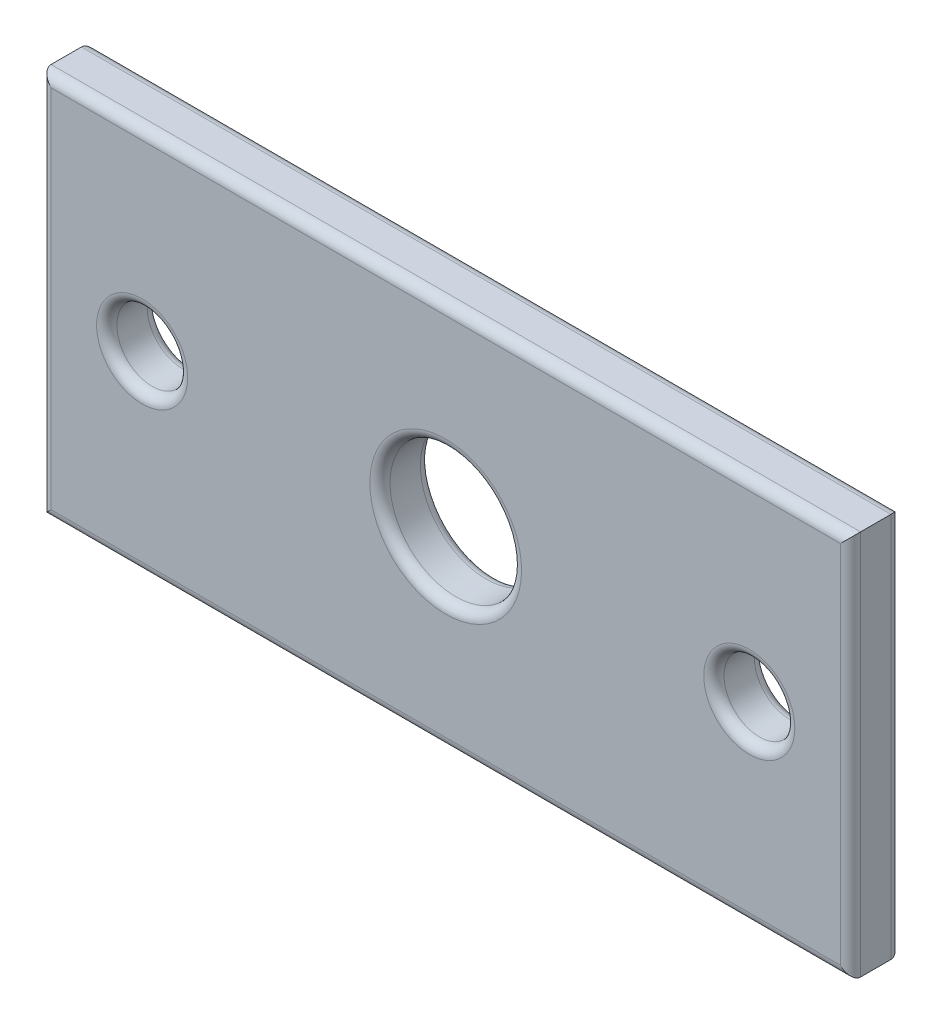
ISO-10303-21;
HEADER;
FILE_DESCRIPTION(('STEP AP214'),'2;1');
FILE_NAME('part.step','',(''),(''),'','','');
FILE_SCHEMA(('AUTOMOTIVE_DESIGN { 1 0 10303 214 1 1 1 1 }'));
ENDSEC;
DATA;
#1=APPLICATION_CONTEXT('core data for automotive mechanical design processes');
#2=APPLICATION_PROTOCOL_DEFINITION('international standard','automotive_design',2000,#1);
#3=PRODUCT_CONTEXT('',#1,'mechanical');
#4=PRODUCT('Part','Part','',(#3));
#5=PRODUCT_RELATED_PRODUCT_CATEGORY('part','',(#4));
#6=PRODUCT_DEFINITION_FORMATION('','',#4);
#7=PRODUCT_DEFINITION_CONTEXT('part definition',#1,'design');
#8=PRODUCT_DEFINITION('design','',#6,#7);
#9=PRODUCT_DEFINITION_SHAPE('','',#8);
#10=(LENGTH_UNIT() NAMED_UNIT(*) SI_UNIT(.MILLI.,.METRE.));
#11=(NAMED_UNIT(*) PLANE_ANGLE_UNIT() SI_UNIT($,.RADIAN.));
#12=(NAMED_UNIT(*) SI_UNIT($,.STERADIAN.) SOLID_ANGLE_UNIT());
#13=UNCERTAINTY_MEASURE_WITH_UNIT(LENGTH_MEASURE(1.E-05),#10,'distance_accuracy_value','');
#14=(GEOMETRIC_REPRESENTATION_CONTEXT(3) GLOBAL_UNCERTAINTY_ASSIGNED_CONTEXT((#13)) GLOBAL_UNIT_ASSIGNED_CONTEXT((#10,
#11,#12)) REPRESENTATION_CONTEXT('',''));
#15=CARTESIAN_POINT('',(0.,0.,0.));
#16=DIRECTION('',(0.,0.,1.));
#17=DIRECTION('',(1.,0.,0.));
#18=AXIS2_PLACEMENT_3D('',#15,#16,#17);
#19=CARTESIAN_POINT('',(80.,0.,5.));
#20=DIRECTION('',(1.,0.,0.));
#21=DIRECTION('',(0.,1.,0.));
#22=AXIS2_PLACEMENT_3D('',#19,#20,#21);
#23=PLANE('',#22);
#24=DIRECTION('',(0.,0.,-1.));
#25=VECTOR('',#24,1.);
#26=CARTESIAN_POINT('',(80.,-38.1,5.));
#27=LINE('',#26,#25);
#28=CARTESIAN_POINT('',(80.,-38.1,4.));
#29=VERTEX_POINT('',#28);
#30=CARTESIAN_POINT('',(80.,-38.1,1.));
#31=VERTEX_POINT('',#30);
#32=EDGE_CURVE('E191',#29,#31,#27,.T.);
#33=ORIENTED_EDGE('',*,*,#32,.T.);
#34=DIRECTION('',(0.,-1.,0.));
#35=VECTOR('',#34,1.);
#36=CARTESIAN_POINT('',(80.,0.,1.));
#37=LINE('',#36,#35);
#38=CARTESIAN_POINT('',(80.,0.,1.));
#39=VERTEX_POINT('',#38);
#40=EDGE_CURVE('E173',#31,#39,#37,.F.);
#41=ORIENTED_EDGE('',*,*,#40,.T.);
#42=DIRECTION('',(0.,0.,-1.));
#43=VECTOR('',#42,1.);
#44=CARTESIAN_POINT('',(80.,0.,5.));
#45=LINE('',#44,#43);
#46=CARTESIAN_POINT('',(80.,0.,4.));
#47=VERTEX_POINT('',#46);
#48=EDGE_CURVE('E122',#47,#39,#45,.T.);
#49=ORIENTED_EDGE('',*,*,#48,.F.);
#50=DIRECTION('',(0.,-1.,0.));
#51=VECTOR('',#50,1.);
#52=CARTESIAN_POINT('',(80.,0.,4.));
#53=LINE('',#52,#51);
#54=EDGE_CURVE('E171',#47,#29,#53,.T.);
#55=ORIENTED_EDGE('',*,*,#54,.T.);
#56=EDGE_LOOP('',(#33,#41,#49,#55));
#57=FACE_BOUND('',#56,.T.);
#58=ADVANCED_FACE('F35',(#57),#23,.T.);
#59=CARTESIAN_POINT('',(0.,0.,5.));
#60=DIRECTION('',(0.,1.,0.));
#61=DIRECTION('',(0.,0.,1.));
#62=AXIS2_PLACEMENT_3D('',#59,#60,#61);
#63=PLANE('',#62);
#64=ORIENTED_EDGE('',*,*,#48,.T.);
#65=DIRECTION('',(1.,0.,0.));
#66=VECTOR('',#65,1.);
#67=CARTESIAN_POINT('',(0.,0.,1.));
#68=LINE('',#67,#66);
#69=CARTESIAN_POINT('',(0.,0.,1.));
#70=VERTEX_POINT('',#69);
#71=EDGE_CURVE('E109',#39,#70,#68,.F.);
#72=ORIENTED_EDGE('',*,*,#71,.T.);
#73=DIRECTION('',(0.,0.,-1.));
#74=VECTOR('',#73,1.);
#75=CARTESIAN_POINT('',(0.,0.,5.));
#76=LINE('',#75,#74);
#77=CARTESIAN_POINT('',(0.,0.,4.));
#78=VERTEX_POINT('',#77);
#79=EDGE_CURVE('E213',#78,#70,#76,.T.);
#80=ORIENTED_EDGE('',*,*,#79,.F.);
#81=DIRECTION('',(1.,0.,0.));
#82=VECTOR('',#81,1.);
#83=CARTESIAN_POINT('',(0.,0.,4.));
#84=LINE('',#83,#82);
#85=EDGE_CURVE('E159',#78,#47,#84,.T.);
#86=ORIENTED_EDGE('',*,*,#85,.T.);
#87=EDGE_LOOP('',(#64,#72,#80,#86));
#88=FACE_BOUND('',#87,.T.);
#89=ADVANCED_FACE('F211',(#88),#63,.T.);
#90=CARTESIAN_POINT('',(0.,0.,5.));
#91=DIRECTION('',(1.,0.,0.));
#92=DIRECTION('',(0.,1.,0.));
#93=AXIS2_PLACEMENT_3D('',#90,#91,#92);
#94=PLANE('',#93);
#95=ORIENTED_EDGE('',*,*,#79,.T.);
#96=DIRECTION('',(0.,-1.,0.));
#97=VECTOR('',#96,1.);
#98=CARTESIAN_POINT('',(0.,0.,1.));
#99=LINE('',#98,#97);
#100=CARTESIAN_POINT('',(0.,-38.1,1.));
#101=VERTEX_POINT('',#100);
#102=EDGE_CURVE('E164',#70,#101,#99,.T.);
#103=ORIENTED_EDGE('',*,*,#102,.T.);
#104=DIRECTION('',(0.,0.,-1.));
#105=VECTOR('',#104,1.);
#106=CARTESIAN_POINT('',(0.,-38.1,5.));
#107=LINE('',#106,#105);
#108=CARTESIAN_POINT('',(0.,-38.1,4.));
#109=VERTEX_POINT('',#108);
#110=EDGE_CURVE('E218',#109,#101,#107,.T.);
#111=ORIENTED_EDGE('',*,*,#110,.F.);
#112=DIRECTION('',(0.,-1.,0.));
#113=VECTOR('',#112,1.);
#114=CARTESIAN_POINT('',(0.,0.,4.));
#115=LINE('',#114,#113);
#116=EDGE_CURVE('E162',#109,#78,#115,.F.);
#117=ORIENTED_EDGE('',*,*,#116,.T.);
#118=EDGE_LOOP('',(#95,#103,#111,#117));
#119=FACE_BOUND('',#118,.T.);
#120=ADVANCED_FACE('F231',(#119),#94,.F.);
#121=CARTESIAN_POINT('',(10.,-19.05,5.));
#122=DIRECTION('',(0.,0.,-1.));
#123=DIRECTION('',(-1.,0.,0.));
#124=AXIS2_PLACEMENT_3D('',#121,#122,#123);
#125=CYLINDRICAL_SURFACE('',#124,3.5);
#126=CARTESIAN_POINT('',(10.,-19.05,1.));
#127=DIRECTION('',(0.,0.,1.));
#128=DIRECTION('',(1.,0.,0.));
#129=AXIS2_PLACEMENT_3D('',#126,#127,#128);
#130=CIRCLE('',#129,3.5);
#131=CARTESIAN_POINT('',(13.5,-19.05,1.));
#132=VERTEX_POINT('',#131);
#133=EDGE_CURVE('E150',#132,#132,#130,.F.);
#134=ORIENTED_EDGE('',*,*,#133,.T.);
#135=EDGE_LOOP('',(#134));
#136=FACE_BOUND('',#135,.T.);
#137=CARTESIAN_POINT('',(10.,-19.05,4.));
#138=DIRECTION('',(0.,0.,1.));
#139=DIRECTION('',(1.,0.,0.));
#140=AXIS2_PLACEMENT_3D('',#137,#138,#139);
#141=CIRCLE('',#140,3.5);
#142=CARTESIAN_POINT('',(13.5,-19.05,4.));
#143=VERTEX_POINT('',#142);
#144=EDGE_CURVE('E147',#143,#143,#141,.T.);
#145=ORIENTED_EDGE('',*,*,#144,.T.);
#146=EDGE_LOOP('',(#145));
#147=FACE_BOUND('',#146,.T.);
#148=ADVANCED_FACE('F380',(#136,#147),#125,.F.);
#149=CARTESIAN_POINT('',(40.,-19.05,5.));
#150=DIRECTION('',(0.,0.,-1.));
#151=DIRECTION('',(-1.,0.,0.));
#152=AXIS2_PLACEMENT_3D('',#149,#150,#151);
#153=CYLINDRICAL_SURFACE('',#152,6.5);
#154=CARTESIAN_POINT('',(40.,-19.05,1.));
#155=DIRECTION('',(0.,0.,1.));
#156=DIRECTION('',(1.,0.,0.));
#157=AXIS2_PLACEMENT_3D('',#154,#155,#156);
#158=CIRCLE('',#157,6.5);
#159=CARTESIAN_POINT('',(46.5,-19.05,1.));
#160=VERTEX_POINT('',#159);
#161=EDGE_CURVE('E156',#160,#160,#158,.F.);
#162=ORIENTED_EDGE('',*,*,#161,.T.);
#163=EDGE_LOOP('',(#162));
#164=FACE_BOUND('',#163,.T.);
#165=CARTESIAN_POINT('',(40.,-19.05,4.));
#166=DIRECTION('',(0.,0.,1.));
#167=DIRECTION('',(1.,0.,0.));
#168=AXIS2_PLACEMENT_3D('',#165,#166,#167);
#169=CIRCLE('',#168,6.5);
#170=CARTESIAN_POINT('',(46.5,-19.05,4.));
#171=VERTEX_POINT('',#170);
#172=EDGE_CURVE('E153',#171,#171,#169,.T.);
#173=ORIENTED_EDGE('',*,*,#172,.T.);
#174=EDGE_LOOP('',(#173));
#175=FACE_BOUND('',#174,.T.);
#176=ADVANCED_FACE('F371',(#164,#175),#153,.F.);
#177=CARTESIAN_POINT('',(0.,-38.1,5.));
#178=DIRECTION('',(0.,1.,0.));
#179=DIRECTION('',(0.,0.,1.));
#180=AXIS2_PLACEMENT_3D('',#177,#178,#179);
#181=PLANE('',#180);
#182=ORIENTED_EDGE('',*,*,#110,.T.);
#183=DIRECTION('',(1.,0.,0.));
#184=VECTOR('',#183,1.);
#185=CARTESIAN_POINT('',(0.,-38.1,1.));
#186=LINE('',#185,#184);
#187=EDGE_CURVE('E169',#101,#31,#186,.T.);
#188=ORIENTED_EDGE('',*,*,#187,.T.);
#189=ORIENTED_EDGE('',*,*,#32,.F.);
#190=DIRECTION('',(1.,0.,0.));
#191=VECTOR('',#190,1.);
#192=CARTESIAN_POINT('',(0.,-38.1,4.));
#193=LINE('',#192,#191);
#194=EDGE_CURVE('E166',#29,#109,#193,.F.);
#195=ORIENTED_EDGE('',*,*,#194,.T.);
#196=EDGE_LOOP('',(#182,#188,#189,#195));
#197=FACE_BOUND('',#196,.T.);
#198=ADVANCED_FACE('F235',(#197),#181,.F.);
#199=CARTESIAN_POINT('',(70.,-19.05,5.));
#200=DIRECTION('',(0.,0.,-1.));
#201=DIRECTION('',(-1.,0.,0.));
#202=AXIS2_PLACEMENT_3D('',#199,#200,#201);
#203=CYLINDRICAL_SURFACE('',#202,3.50000000000001);
#204=CARTESIAN_POINT('',(70.,-19.05,1.));
#205=DIRECTION('',(0.,0.,1.));
#206=DIRECTION('',(1.,0.,0.));
#207=AXIS2_PLACEMENT_3D('',#204,#205,#206);
#208=CIRCLE('',#207,3.50000000000001);
#209=CARTESIAN_POINT('',(73.5,-19.05,1.));
#210=VERTEX_POINT('',#209);
#211=EDGE_CURVE('E144',#210,#210,#208,.F.);
#212=ORIENTED_EDGE('',*,*,#211,.T.);
#213=EDGE_LOOP('',(#212));
#214=FACE_BOUND('',#213,.T.);
#215=CARTESIAN_POINT('',(70.,-19.05,4.));
#216=DIRECTION('',(0.,0.,1.));
#217=DIRECTION('',(1.,0.,0.));
#218=AXIS2_PLACEMENT_3D('',#215,#216,#217);
#219=CIRCLE('',#218,3.50000000000001);
#220=CARTESIAN_POINT('',(73.5,-19.05,4.));
#221=VERTEX_POINT('',#220);
#222=EDGE_CURVE('E141',#221,#221,#219,.T.);
#223=ORIENTED_EDGE('',*,*,#222,.T.);
#224=EDGE_LOOP('',(#223));
#225=FACE_BOUND('',#224,.T.);
#226=ADVANCED_FACE('F243',(#214,#225),#203,.F.);
#227=CARTESIAN_POINT('',(0.,0.,5.));
#228=DIRECTION('',(0.,0.,1.));
#229=DIRECTION('',(1.,0.,0.));
#230=AXIS2_PLACEMENT_3D('',#227,#228,#229);
#231=PLANE('',#230);
#232=CARTESIAN_POINT('',(70.,-19.05,5.));
#233=DIRECTION('',(0.,0.,1.));
#234=DIRECTION('',(1.,0.,0.));
#235=AXIS2_PLACEMENT_3D('',#232,#233,#234);
#236=CIRCLE('',#235,4.50000000000001);
#237=CARTESIAN_POINT('',(74.5,-19.05,5.));
#238=VERTEX_POINT('',#237);
#239=EDGE_CURVE('E11',#238,#238,#236,.F.);
#240=ORIENTED_EDGE('',*,*,#239,.T.);
#241=EDGE_LOOP('',(#240));
#242=FACE_BOUND('',#241,.T.);
#243=CARTESIAN_POINT('',(10.,-19.05,5.));
#244=DIRECTION('',(0.,0.,1.));
#245=DIRECTION('',(1.,0.,0.));
#246=AXIS2_PLACEMENT_3D('',#243,#244,#245);
#247=CIRCLE('',#246,4.5);
#248=CARTESIAN_POINT('',(14.5,-19.05,5.));
#249=VERTEX_POINT('',#248);
#250=EDGE_CURVE('E44',#249,#249,#247,.F.);
#251=ORIENTED_EDGE('',*,*,#250,.T.);
#252=EDGE_LOOP('',(#251));
#253=FACE_BOUND('',#252,.T.);
#254=CARTESIAN_POINT('',(40.,-19.05,5.));
#255=DIRECTION('',(0.,0.,1.));
#256=DIRECTION('',(1.,0.,0.));
#257=AXIS2_PLACEMENT_3D('',#254,#255,#256);
#258=CIRCLE('',#257,7.5);
#259=CARTESIAN_POINT('',(47.5,-19.05,5.));
#260=VERTEX_POINT('',#259);
#261=EDGE_CURVE('E181',#260,#260,#258,.F.);
#262=ORIENTED_EDGE('',*,*,#261,.T.);
#263=EDGE_LOOP('',(#262));
#264=FACE_BOUND('',#263,.T.);
#265=DIRECTION('',(0.,-1.,0.));
#266=VECTOR('',#265,1.);
#267=CARTESIAN_POINT('',(1.,-38.1,5.));
#268=LINE('',#267,#266);
#269=CARTESIAN_POINT('',(1.,-1.,5.));
#270=VERTEX_POINT('',#269);
#271=CARTESIAN_POINT('',(1.,-37.1,5.));
#272=VERTEX_POINT('',#271);
#273=EDGE_CURVE('E52',#270,#272,#268,.T.);
#274=ORIENTED_EDGE('',*,*,#273,.T.);
#275=DIRECTION('',(1.,0.,0.));
#276=VECTOR('',#275,1.);
#277=CARTESIAN_POINT('',(80.,-37.1,5.));
#278=LINE('',#277,#276);
#279=CARTESIAN_POINT('',(79.,-37.1,5.));
#280=VERTEX_POINT('',#279);
#281=EDGE_CURVE('E179',#272,#280,#278,.T.);
#282=ORIENTED_EDGE('',*,*,#281,.T.);
#283=DIRECTION('',(0.,-1.,0.));
#284=VECTOR('',#283,1.);
#285=CARTESIAN_POINT('',(79.,0.,5.));
#286=LINE('',#285,#284);
#287=CARTESIAN_POINT('',(79.,-1.,5.));
#288=VERTEX_POINT('',#287);
#289=EDGE_CURVE('E175',#280,#288,#286,.F.);
#290=ORIENTED_EDGE('',*,*,#289,.T.);
#291=DIRECTION('',(1.,0.,0.));
#292=VECTOR('',#291,1.);
#293=CARTESIAN_POINT('',(0.,-1.,5.));
#294=LINE('',#293,#292);
#295=EDGE_CURVE('E57',#288,#270,#294,.F.);
#296=ORIENTED_EDGE('',*,*,#295,.T.);
#297=EDGE_LOOP('',(#274,#282,#290,#296));
#298=FACE_BOUND('',#297,.T.);
#299=ADVANCED_FACE('F241',(#242,#253,#264,#298),#231,.T.);
#300=CARTESIAN_POINT('',(0.,0.,0.));
#301=DIRECTION('',(0.,0.,1.));
#302=DIRECTION('',(1.,0.,0.));
#303=AXIS2_PLACEMENT_3D('',#300,#301,#302);
#304=PLANE('',#303);
#305=CARTESIAN_POINT('',(70.,-19.05,0.));
#306=DIRECTION('',(0.,0.,1.));
#307=DIRECTION('',(1.,0.,0.));
#308=AXIS2_PLACEMENT_3D('',#305,#306,#307);
#309=CIRCLE('',#308,4.50000000000001);
#310=CARTESIAN_POINT('',(74.5,-19.05,0.));
#311=VERTEX_POINT('',#310);
#312=EDGE_CURVE('E138',#311,#311,#309,.T.);
#313=ORIENTED_EDGE('',*,*,#312,.T.);
#314=EDGE_LOOP('',(#313));
#315=FACE_BOUND('',#314,.T.);
#316=CARTESIAN_POINT('',(10.,-19.05,0.));
#317=DIRECTION('',(0.,0.,1.));
#318=DIRECTION('',(1.,0.,0.));
#319=AXIS2_PLACEMENT_3D('',#316,#317,#318);
#320=CIRCLE('',#319,4.5);
#321=CARTESIAN_POINT('',(14.5,-19.05,0.));
#322=VERTEX_POINT('',#321);
#323=EDGE_CURVE('E131',#322,#322,#320,.T.);
#324=ORIENTED_EDGE('',*,*,#323,.T.);
#325=EDGE_LOOP('',(#324));
#326=FACE_BOUND('',#325,.T.);
#327=CARTESIAN_POINT('',(40.,-19.05,0.));
#328=DIRECTION('',(0.,0.,1.));
#329=DIRECTION('',(1.,0.,0.));
#330=AXIS2_PLACEMENT_3D('',#327,#328,#329);
#331=CIRCLE('',#330,7.5);
#332=CARTESIAN_POINT('',(47.5,-19.05,0.));
#333=VERTEX_POINT('',#332);
#334=EDGE_CURVE('E128',#333,#333,#331,.T.);
#335=ORIENTED_EDGE('',*,*,#334,.T.);
#336=EDGE_LOOP('',(#335));
#337=FACE_BOUND('',#336,.T.);
#338=DIRECTION('',(0.,-1.,0.));
#339=VECTOR('',#338,1.);
#340=CARTESIAN_POINT('',(1.,0.,0.));
#341=LINE('',#340,#339);
#342=CARTESIAN_POINT('',(1.,-37.1,0.));
#343=VERTEX_POINT('',#342);
#344=CARTESIAN_POINT('',(1.,-1.,0.));
#345=VERTEX_POINT('',#344);
#346=EDGE_CURVE('E126',#343,#345,#341,.F.);
#347=ORIENTED_EDGE('',*,*,#346,.T.);
#348=DIRECTION('',(1.,0.,0.));
#349=VECTOR('',#348,1.);
#350=CARTESIAN_POINT('',(80.,-1.,0.));
#351=LINE('',#350,#349);
#352=CARTESIAN_POINT('',(79.,-1.,0.));
#353=VERTEX_POINT('',#352);
#354=EDGE_CURVE('E107',#345,#353,#351,.T.);
#355=ORIENTED_EDGE('',*,*,#354,.T.);
#356=DIRECTION('',(0.,-1.,0.));
#357=VECTOR('',#356,1.);
#358=CARTESIAN_POINT('',(79.,-38.1,0.));
#359=LINE('',#358,#357);
#360=CARTESIAN_POINT('',(79.,-37.1,0.));
#361=VERTEX_POINT('',#360);
#362=EDGE_CURVE('E115',#353,#361,#359,.T.);
#363=ORIENTED_EDGE('',*,*,#362,.T.);
#364=DIRECTION('',(1.,0.,0.));
#365=VECTOR('',#364,1.);
#366=CARTESIAN_POINT('',(0.,-37.1,0.));
#367=LINE('',#366,#365);
#368=EDGE_CURVE('E121',#361,#343,#367,.F.);
#369=ORIENTED_EDGE('',*,*,#368,.T.);
#370=EDGE_LOOP('',(#347,#355,#363,#369));
#371=FACE_BOUND('',#370,.T.);
#372=ADVANCED_FACE('F124',(#315,#326,#337,#371),#304,.F.);
#373=CARTESIAN_POINT('',(70.,-19.05,1.));
#374=DIRECTION('',(0.,0.,1.));
#375=DIRECTION('',(1.,0.,0.));
#376=AXIS2_PLACEMENT_3D('',#373,#374,#375);
#377=TOROIDAL_SURFACE('',#376,4.50000000000001,1.);
#378=ORIENTED_EDGE('',*,*,#211,.F.);
#379=EDGE_LOOP('',(#378));
#380=FACE_BOUND('',#379,.T.);
#381=ORIENTED_EDGE('',*,*,#312,.F.);
#382=EDGE_LOOP('',(#381));
#383=FACE_BOUND('',#382,.T.);
#384=ADVANCED_FACE('F250',(#380,#383),#377,.T.);
#385=CARTESIAN_POINT('',(10.,-19.05,1.));
#386=DIRECTION('',(0.,0.,1.));
#387=DIRECTION('',(1.,0.,0.));
#388=AXIS2_PLACEMENT_3D('',#385,#386,#387);
#389=TOROIDAL_SURFACE('',#388,4.5,1.);
#390=ORIENTED_EDGE('',*,*,#133,.F.);
#391=EDGE_LOOP('',(#390));
#392=FACE_BOUND('',#391,.T.);
#393=ORIENTED_EDGE('',*,*,#323,.F.);
#394=EDGE_LOOP('',(#393));
#395=FACE_BOUND('',#394,.T.);
#396=ADVANCED_FACE('F266',(#392,#395),#389,.T.);
#397=CARTESIAN_POINT('',(40.,-19.05,1.));
#398=DIRECTION('',(0.,0.,1.));
#399=DIRECTION('',(1.,0.,0.));
#400=AXIS2_PLACEMENT_3D('',#397,#398,#399);
#401=TOROIDAL_SURFACE('',#400,7.5,1.);
#402=ORIENTED_EDGE('',*,*,#161,.F.);
#403=EDGE_LOOP('',(#402));
#404=FACE_BOUND('',#403,.T.);
#405=ORIENTED_EDGE('',*,*,#334,.F.);
#406=EDGE_LOOP('',(#405));
#407=FACE_BOUND('',#406,.T.);
#408=ADVANCED_FACE('F270',(#404,#407),#401,.T.);
#409=CARTESIAN_POINT('',(0.,-37.1,1.));
#410=DIRECTION('',(1.,0.,0.));
#411=DIRECTION('',(0.,0.,-1.));
#412=AXIS2_PLACEMENT_3D('',#409,#410,#411);
#413=CYLINDRICAL_SURFACE('',#412,1.);
#414=CARTESIAN_POINT('',(79.,-37.1,1.));
#415=DIRECTION('',(0.707106781186548,0.707106781186547,0.));
#416=DIRECTION('',(-0.707106781186547,0.707106781186548,0.));
#417=AXIS2_PLACEMENT_3D('',#414,#415,#416);
#418=ELLIPSE('',#417,1.41421356237309,1.);
#419=EDGE_CURVE('E118',#31,#361,#418,.T.);
#420=ORIENTED_EDGE('',*,*,#419,.F.);
#421=ORIENTED_EDGE('',*,*,#187,.F.);
#422=CARTESIAN_POINT('',(1.,-37.1,1.));
#423=DIRECTION('',(0.707106781186547,-0.707106781186547,0.));
#424=DIRECTION('',(0.707106781186547,0.707106781186548,0.));
#425=AXIS2_PLACEMENT_3D('',#422,#423,#424);
#426=ELLIPSE('',#425,1.41421356237309,1.);
#427=EDGE_CURVE('E188',#343,#101,#426,.F.);
#428=ORIENTED_EDGE('',*,*,#427,.F.);
#429=ORIENTED_EDGE('',*,*,#368,.F.);
#430=EDGE_LOOP('',(#420,#421,#428,#429));
#431=FACE_BOUND('',#430,.T.);
#432=ADVANCED_FACE('F224',(#431),#413,.T.);
#433=CARTESIAN_POINT('',(1.,0.,1.));
#434=DIRECTION('',(0.,-1.,0.));
#435=DIRECTION('',(1.,0.,0.));
#436=AXIS2_PLACEMENT_3D('',#433,#434,#435);
#437=CYLINDRICAL_SURFACE('',#436,1.);
#438=ORIENTED_EDGE('',*,*,#427,.T.);
#439=ORIENTED_EDGE('',*,*,#102,.F.);
#440=CARTESIAN_POINT('',(1.,-1.,1.));
#441=DIRECTION('',(-0.707106781186547,-0.707106781186548,0.));
#442=DIRECTION('',(0.707106781186547,-0.707106781186547,0.));
#443=AXIS2_PLACEMENT_3D('',#440,#441,#442);
#444=ELLIPSE('',#443,1.4142135623731,1.);
#445=EDGE_CURVE('E112',#345,#70,#444,.F.);
#446=ORIENTED_EDGE('',*,*,#445,.F.);
#447=ORIENTED_EDGE('',*,*,#346,.F.);
#448=EDGE_LOOP('',(#438,#439,#446,#447));
#449=FACE_BOUND('',#448,.T.);
#450=ADVANCED_FACE('F227',(#449),#437,.T.);
#451=CARTESIAN_POINT('',(79.,0.,1.));
#452=DIRECTION('',(0.,1.,0.));
#453=DIRECTION('',(-1.,0.,0.));
#454=AXIS2_PLACEMENT_3D('',#451,#452,#453);
#455=CYLINDRICAL_SURFACE('',#454,1.);
#456=ORIENTED_EDGE('',*,*,#419,.T.);
#457=ORIENTED_EDGE('',*,*,#362,.F.);
#458=CARTESIAN_POINT('',(79.,-1.,1.));
#459=DIRECTION('',(-0.707106781186547,0.707106781186548,0.));
#460=DIRECTION('',(0.707106781186548,0.707106781186547,0.));
#461=AXIS2_PLACEMENT_3D('',#458,#459,#460);
#462=ELLIPSE('',#461,1.4142135623731,1.);
#463=EDGE_CURVE('E103',#39,#353,#462,.T.);
#464=ORIENTED_EDGE('',*,*,#463,.F.);
#465=ORIENTED_EDGE('',*,*,#40,.F.);
#466=EDGE_LOOP('',(#456,#457,#464,#465));
#467=FACE_BOUND('',#466,.T.);
#468=ADVANCED_FACE('F116',(#467),#455,.T.);
#469=CARTESIAN_POINT('',(0.,-1.,1.));
#470=DIRECTION('',(-1.,0.,0.));
#471=DIRECTION('',(0.,0.,1.));
#472=AXIS2_PLACEMENT_3D('',#469,#470,#471);
#473=CYLINDRICAL_SURFACE('',#472,1.);
#474=ORIENTED_EDGE('',*,*,#445,.T.);
#475=ORIENTED_EDGE('',*,*,#71,.F.);
#476=ORIENTED_EDGE('',*,*,#463,.T.);
#477=ORIENTED_EDGE('',*,*,#354,.F.);
#478=EDGE_LOOP('',(#474,#475,#476,#477));
#479=FACE_BOUND('',#478,.T.);
#480=ADVANCED_FACE('F105',(#479),#473,.T.);
#481=CARTESIAN_POINT('',(70.,-19.05,4.));
#482=DIRECTION('',(0.,0.,1.));
#483=DIRECTION('',(1.,0.,0.));
#484=AXIS2_PLACEMENT_3D('',#481,#482,#483);
#485=TOROIDAL_SURFACE('',#484,4.50000000000001,1.);
#486=ORIENTED_EDGE('',*,*,#239,.F.);
#487=EDGE_LOOP('',(#486));
#488=FACE_BOUND('',#487,.T.);
#489=ORIENTED_EDGE('',*,*,#222,.F.);
#490=EDGE_LOOP('',(#489));
#491=FACE_BOUND('',#490,.T.);
#492=ADVANCED_FACE('F277',(#488,#491),#485,.T.);
#493=CARTESIAN_POINT('',(10.,-19.05,4.));
#494=DIRECTION('',(0.,0.,1.));
#495=DIRECTION('',(1.,0.,0.));
#496=AXIS2_PLACEMENT_3D('',#493,#494,#495);
#497=TOROIDAL_SURFACE('',#496,4.5,1.);
#498=ORIENTED_EDGE('',*,*,#250,.F.);
#499=EDGE_LOOP('',(#498));
#500=FACE_BOUND('',#499,.T.);
#501=ORIENTED_EDGE('',*,*,#144,.F.);
#502=EDGE_LOOP('',(#501));
#503=FACE_BOUND('',#502,.T.);
#504=ADVANCED_FACE('F286',(#500,#503),#497,.T.);
#505=CARTESIAN_POINT('',(40.,-19.05,4.));
#506=DIRECTION('',(0.,0.,1.));
#507=DIRECTION('',(1.,0.,0.));
#508=AXIS2_PLACEMENT_3D('',#505,#506,#507);
#509=TOROIDAL_SURFACE('',#508,7.5,1.);
#510=ORIENTED_EDGE('',*,*,#261,.F.);
#511=EDGE_LOOP('',(#510));
#512=FACE_BOUND('',#511,.T.);
#513=ORIENTED_EDGE('',*,*,#172,.F.);
#514=EDGE_LOOP('',(#513));
#515=FACE_BOUND('',#514,.T.);
#516=ADVANCED_FACE('F290',(#512,#515),#509,.T.);
#517=CARTESIAN_POINT('',(0.,-1.,4.));
#518=DIRECTION('',(1.,0.,0.));
#519=DIRECTION('',(0.,0.,-1.));
#520=AXIS2_PLACEMENT_3D('',#517,#518,#519);
#521=CYLINDRICAL_SURFACE('',#520,1.);
#522=CARTESIAN_POINT('',(79.,-1.,4.));
#523=DIRECTION('',(0.707106781186547,-0.707106781186548,0.));
#524=DIRECTION('',(-0.707106781186548,-0.707106781186547,0.));
#525=AXIS2_PLACEMENT_3D('',#522,#523,#524);
#526=ELLIPSE('',#525,1.4142135623731,1.);
#527=EDGE_CURVE('E195',#47,#288,#526,.T.);
#528=ORIENTED_EDGE('',*,*,#527,.F.);
#529=ORIENTED_EDGE('',*,*,#85,.F.);
#530=CARTESIAN_POINT('',(1.,-1.,4.));
#531=DIRECTION('',(0.707106781186547,0.707106781186548,0.));
#532=DIRECTION('',(0.707106781186547,-0.707106781186547,0.));
#533=AXIS2_PLACEMENT_3D('',#530,#531,#532);
#534=ELLIPSE('',#533,1.4142135623731,1.);
#535=EDGE_CURVE('E39',#270,#78,#534,.F.);
#536=ORIENTED_EDGE('',*,*,#535,.F.);
#537=ORIENTED_EDGE('',*,*,#295,.F.);
#538=EDGE_LOOP('',(#528,#529,#536,#537));
#539=FACE_BOUND('',#538,.T.);
#540=ADVANCED_FACE('F37',(#539),#521,.T.);
#541=CARTESIAN_POINT('',(1.,0.,4.));
#542=DIRECTION('',(0.,1.,0.));
#543=DIRECTION('',(-1.,0.,0.));
#544=AXIS2_PLACEMENT_3D('',#541,#542,#543);
#545=CYLINDRICAL_SURFACE('',#544,1.);
#546=ORIENTED_EDGE('',*,*,#535,.T.);
#547=ORIENTED_EDGE('',*,*,#116,.F.);
#548=CARTESIAN_POINT('',(1.,-37.1,4.));
#549=DIRECTION('',(-0.707106781186547,0.707106781186547,0.));
#550=DIRECTION('',(0.707106781186547,0.707106781186548,0.));
#551=AXIS2_PLACEMENT_3D('',#548,#549,#550);
#552=ELLIPSE('',#551,1.41421356237309,1.);
#553=EDGE_CURVE('E194',#272,#109,#552,.F.);
#554=ORIENTED_EDGE('',*,*,#553,.F.);
#555=ORIENTED_EDGE('',*,*,#273,.F.);
#556=EDGE_LOOP('',(#546,#547,#554,#555));
#557=FACE_BOUND('',#556,.T.);
#558=ADVANCED_FACE('F204',(#557),#545,.T.);
#559=CARTESIAN_POINT('',(79.,0.,4.));
#560=DIRECTION('',(0.,-1.,0.));
#561=DIRECTION('',(1.,0.,0.));
#562=AXIS2_PLACEMENT_3D('',#559,#560,#561);
#563=CYLINDRICAL_SURFACE('',#562,1.);
#564=ORIENTED_EDGE('',*,*,#527,.T.);
#565=ORIENTED_EDGE('',*,*,#289,.F.);
#566=CARTESIAN_POINT('',(79.,-37.1,4.));
#567=DIRECTION('',(-0.707106781186548,-0.707106781186547,0.));
#568=DIRECTION('',(0.707106781186547,-0.707106781186548,0.));
#569=AXIS2_PLACEMENT_3D('',#566,#567,#568);
#570=ELLIPSE('',#569,1.41421356237309,1.);
#571=EDGE_CURVE('E192',#29,#280,#570,.T.);
#572=ORIENTED_EDGE('',*,*,#571,.F.);
#573=ORIENTED_EDGE('',*,*,#54,.F.);
#574=EDGE_LOOP('',(#564,#565,#572,#573));
#575=FACE_BOUND('',#574,.T.);
#576=ADVANCED_FACE('F240',(#575),#563,.T.);
#577=CARTESIAN_POINT('',(0.,-37.1,4.));
#578=DIRECTION('',(-1.,0.,0.));
#579=DIRECTION('',(0.,0.,1.));
#580=AXIS2_PLACEMENT_3D('',#577,#578,#579);
#581=CYLINDRICAL_SURFACE('',#580,1.);
#582=ORIENTED_EDGE('',*,*,#553,.T.);
#583=ORIENTED_EDGE('',*,*,#194,.F.);
#584=ORIENTED_EDGE('',*,*,#571,.T.);
#585=ORIENTED_EDGE('',*,*,#281,.F.);
#586=EDGE_LOOP('',(#582,#583,#584,#585));
#587=FACE_BOUND('',#586,.T.);
#588=ADVANCED_FACE('F238',(#587),#581,.T.);
#589=CLOSED_SHELL('',(#58,#89,#120,#148,#176,#198,#226,#299,#372,#384,#396,#408,#432,#450,#468,
#480,#492,#504,#516,#540,#558,#576,#588));
#590=MANIFOLD_SOLID_BREP('B2',#589);
#591=ADVANCED_BREP_SHAPE_REPRESENTATION('',(#18,#590),#14);
#592=SHAPE_DEFINITION_REPRESENTATION(#9,#591);
ENDSEC;
END-ISO-10303-21;
